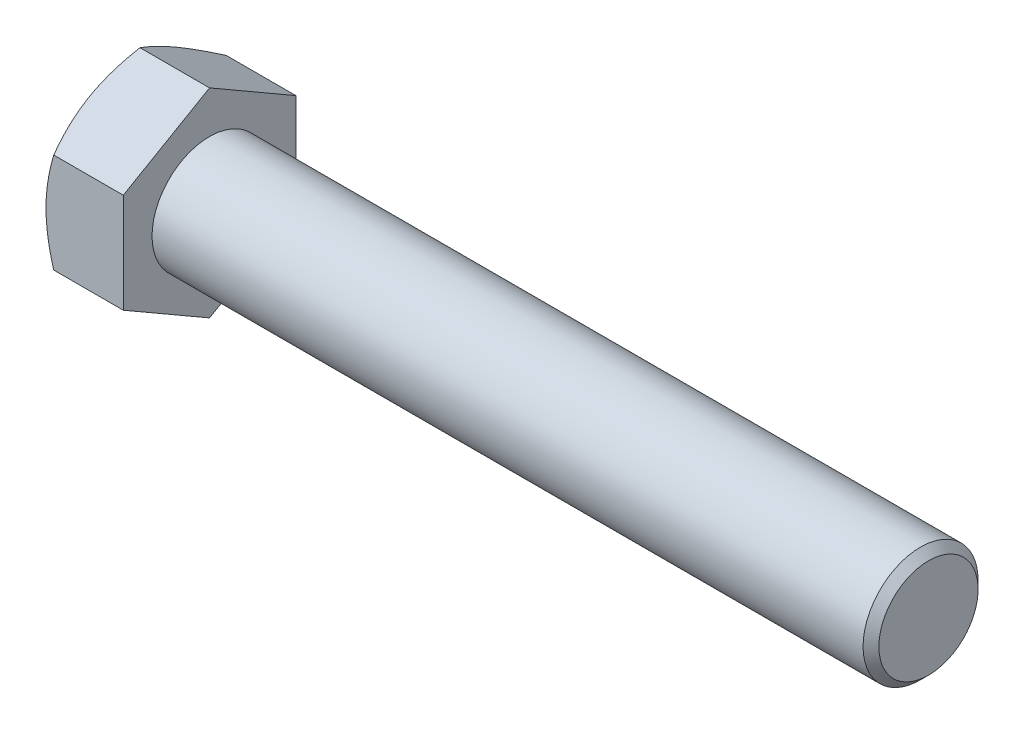
ISO-10303-21;
HEADER;
FILE_DESCRIPTION(('STEP AP214'),'2;1');
FILE_NAME('part.step','',(''),(''),'','','');
FILE_SCHEMA(('AUTOMOTIVE_DESIGN { 1 0 10303 214 1 1 1 1 }'));
ENDSEC;
DATA;
#1=APPLICATION_CONTEXT('core data for automotive mechanical design processes');
#2=APPLICATION_PROTOCOL_DEFINITION('international standard','automotive_design',2000,#1);
#3=PRODUCT_CONTEXT('',#1,'mechanical');
#4=PRODUCT('Part','Part','',(#3));
#5=PRODUCT_RELATED_PRODUCT_CATEGORY('part','',(#4));
#6=PRODUCT_DEFINITION_FORMATION('','',#4);
#7=PRODUCT_DEFINITION_CONTEXT('part definition',#1,'design');
#8=PRODUCT_DEFINITION('design','',#6,#7);
#9=PRODUCT_DEFINITION_SHAPE('','',#8);
#10=(LENGTH_UNIT() NAMED_UNIT(*) SI_UNIT(.MILLI.,.METRE.));
#11=(NAMED_UNIT(*) PLANE_ANGLE_UNIT() SI_UNIT($,.RADIAN.));
#12=(NAMED_UNIT(*) SI_UNIT($,.STERADIAN.) SOLID_ANGLE_UNIT());
#13=UNCERTAINTY_MEASURE_WITH_UNIT(LENGTH_MEASURE(1.E-05),#10,'distance_accuracy_value','');
#14=(GEOMETRIC_REPRESENTATION_CONTEXT(3) GLOBAL_UNCERTAINTY_ASSIGNED_CONTEXT((#13)) GLOBAL_UNIT_ASSIGNED_CONTEXT((#10,
#11,#12)) REPRESENTATION_CONTEXT('',''));
#15=CARTESIAN_POINT('',(0.,0.,0.));
#16=DIRECTION('',(0.,0.,1.));
#17=DIRECTION('',(1.,0.,0.));
#18=AXIS2_PLACEMENT_3D('',#15,#16,#17);
#19=CARTESIAN_POINT('',(0.,13.856406460551,0.));
#20=DIRECTION('',(1.,0.,0.));
#21=DIRECTION('',(0.,0.,-1.));
#22=AXIS2_PLACEMENT_3D('',#19,#20,#21);
#23=PLANE('',#22);
#24=CARTESIAN_POINT('',(0.,0.,0.));
#25=DIRECTION('',(1.,0.,0.));
#26=DIRECTION('',(0.,1.,0.));
#27=AXIS2_PLACEMENT_3D('',#24,#25,#26);
#28=CIRCLE('',#27,12.);
#29=CARTESIAN_POINT('',(0.,-10.3923048454133,-6.00000000000001));
#30=VERTEX_POINT('',#29);
#31=CARTESIAN_POINT('',(0.,0.,-12.));
#32=VERTEX_POINT('',#31);
#33=EDGE_CURVE('E328',#30,#32,#28,.T.);
#34=ORIENTED_EDGE('',*,*,#33,.F.);
#35=CARTESIAN_POINT('',(0.,0.,0.));
#36=DIRECTION('',(1.,0.,0.));
#37=DIRECTION('',(0.,1.,0.));
#38=AXIS2_PLACEMENT_3D('',#35,#36,#37);
#39=CIRCLE('',#38,12.);
#40=CARTESIAN_POINT('',(0.,-10.3923048454133,6.00000000000002));
#41=VERTEX_POINT('',#40);
#42=EDGE_CURVE('E327',#41,#30,#39,.T.);
#43=ORIENTED_EDGE('',*,*,#42,.F.);
#44=CARTESIAN_POINT('',(0.,0.,0.));
#45=DIRECTION('',(1.,0.,0.));
#46=DIRECTION('',(0.,1.,0.));
#47=AXIS2_PLACEMENT_3D('',#44,#45,#46);
#48=CIRCLE('',#47,12.);
#49=CARTESIAN_POINT('',(0.,0.,12.));
#50=VERTEX_POINT('',#49);
#51=EDGE_CURVE('E89',#50,#41,#48,.T.);
#52=ORIENTED_EDGE('',*,*,#51,.F.);
#53=CARTESIAN_POINT('',(0.,0.,0.));
#54=DIRECTION('',(1.,0.,0.));
#55=DIRECTION('',(0.,0.,-1.));
#56=AXIS2_PLACEMENT_3D('',#53,#54,#55);
#57=CIRCLE('',#56,12.);
#58=CARTESIAN_POINT('',(0.,10.3923048454133,6.00000000000001));
#59=VERTEX_POINT('',#58);
#60=EDGE_CURVE('E87',#59,#50,#57,.T.);
#61=ORIENTED_EDGE('',*,*,#60,.F.);
#62=CARTESIAN_POINT('',(0.,0.,0.));
#63=DIRECTION('',(1.,0.,0.));
#64=DIRECTION('',(0.,0.,-1.));
#65=AXIS2_PLACEMENT_3D('',#62,#63,#64);
#66=CIRCLE('',#65,12.);
#67=CARTESIAN_POINT('',(0.,10.3923048454133,-6.00000000000002));
#68=VERTEX_POINT('',#67);
#69=EDGE_CURVE('E20',#68,#59,#66,.T.);
#70=ORIENTED_EDGE('',*,*,#69,.F.);
#71=CARTESIAN_POINT('',(0.,0.,0.));
#72=DIRECTION('',(1.,0.,0.));
#73=DIRECTION('',(0.,0.,-1.));
#74=AXIS2_PLACEMENT_3D('',#71,#72,#73);
#75=CIRCLE('',#74,12.);
#76=EDGE_CURVE('E255',#32,#68,#75,.T.);
#77=ORIENTED_EDGE('',*,*,#76,.F.);
#78=EDGE_LOOP('',(#34,#43,#52,#61,#70,#77));
#79=FACE_BOUND('',#78,.T.);
#80=ADVANCED_FACE('F17',(#79),#23,.F.);
#81=CARTESIAN_POINT('',(1.07822755034284,0.,0.));
#82=DIRECTION('',(1.,0.,0.));
#83=DIRECTION('',(0.,0.,-1.));
#84=AXIS2_PLACEMENT_3D('',#81,#82,#83);
#85=CONICAL_SURFACE('',#84,13.8675448993143,1.0471975511966);
#86=CARTESIAN_POINT('',(1.07179676972449,13.856406460551,0.));
#87=CARTESIAN_POINT('',(0.908940799911309,13.5743006175821,-0.488621653134201));
#88=CARTESIAN_POINT('',(0.75975526693387,13.2901242461885,-0.980829566698536));
#89=CARTESIAN_POINT('',(0.562274952239646,12.8616146811394,-1.72302990489287));
#90=CARTESIAN_POINT('',(0.500950068318412,12.7187583400199,-1.9704643458952));
#91=CARTESIAN_POINT('',(0.387776318757366,12.4321091330912,-2.46695533624495));
#92=CARTESIAN_POINT('',(0.33592687570903,12.2883163249013,-2.71601178579294));
#93=CARTESIAN_POINT('',(0.242530246242278,11.9997152642606,-3.21588348594086));
#94=CARTESIAN_POINT('',(0.200995561015241,11.8549059962408,-3.46670049555793));
#95=CARTESIAN_POINT('',(0.129101019121797,11.5645948484026,-3.96953415361745));
#96=CARTESIAN_POINT('',(0.0987408683331406,11.4190929869158,-4.22155077030845));
#97=CARTESIAN_POINT('',(0.0497242910385124,11.1268576505267,-4.72771722070131));
#98=CARTESIAN_POINT('',(0.0311273829961278,10.9801216596432,-4.98187141221056));
#99=CARTESIAN_POINT('',(0.0062393443172623,10.6863610957437,-5.49067963414449));
#100=CARTESIAN_POINT('',(-4.93491989079313E-05,10.539336471344,-5.74533375356847));
#101=CARTESIAN_POINT('',(0.,10.3923048454133,-6.00000000000001));
#102=B_SPLINE_CURVE_WITH_KNOTS('',3,(#86,#87,#88,#89,#90,#91,#92,#93,#94,#95,#96,#97,#98,#99,
#100,#101),.UNSPECIFIED.,.F.,.F.,(4,2,2,2,2,2,2,4),(0.,1.76168798013763,2.63822760396066,
3.5147137959332,4.39225713601218,5.2697773768308,6.15170281893046,7.03380287133137),.UNSPECIFIED.);
#103=CARTESIAN_POINT('',(1.07179676972449,13.856406460551,0.));
#104=VERTEX_POINT('',#103);
#105=EDGE_CURVE('E99',#104,#68,#102,.T.);
#106=ORIENTED_EDGE('',*,*,#105,.T.);
#107=ORIENTED_EDGE('',*,*,#69,.T.);
#108=CARTESIAN_POINT('',(0.,10.3923048454133,6.00000000000001));
#109=CARTESIAN_POINT('',(-4.93491989066502E-05,10.539336471344,5.74533375356847));
#110=CARTESIAN_POINT('',(0.00623934431726331,10.6863610957437,5.49067963414449));
#111=CARTESIAN_POINT('',(0.0311273829961284,10.9801216596432,4.98187141221056));
#112=CARTESIAN_POINT('',(0.0497242910385127,11.1268576505267,4.72771722070131));
#113=CARTESIAN_POINT('',(0.0987408683331407,11.4190929869158,4.22155077030845));
#114=CARTESIAN_POINT('',(0.129101019121797,11.5645948484026,3.96953415361745));
#115=CARTESIAN_POINT('',(0.200995561015241,11.8549059962408,3.46670049555793));
#116=CARTESIAN_POINT('',(0.242530246242278,11.9997152642606,3.21588348594086));
#117=CARTESIAN_POINT('',(0.33592687570903,12.2883163249013,2.71601178579294));
#118=CARTESIAN_POINT('',(0.387776318757366,12.4321091330912,2.46695533624495));
#119=CARTESIAN_POINT('',(0.500950068318412,12.7187583400199,1.97046434589519));
#120=CARTESIAN_POINT('',(0.562274952239646,12.8616146811394,1.72302990489287));
#121=CARTESIAN_POINT('',(0.75975526693387,13.2901242461885,0.980829566698535));
#122=CARTESIAN_POINT('',(0.90894079991131,13.5743006175821,0.4886216531342));
#123=CARTESIAN_POINT('',(1.07179676972449,13.856406460551,0.));
#124=B_SPLINE_CURVE_WITH_KNOTS('',3,(#108,#109,#110,#111,#112,#113,#114,#115,#116,#117,#118,
#119,#120,#121,#122,#123),.UNSPECIFIED.,.F.,.F.,(4,2,2,2,2,2,2,4),(0.,0.882100052400904,
1.76402549450056,2.64154573531919,3.51908907539817,4.39557526737071,5.27211489119374,
7.03380287133137),.UNSPECIFIED.);
#125=EDGE_CURVE('E97',#59,#104,#124,.T.);
#126=ORIENTED_EDGE('',*,*,#125,.T.);
#127=EDGE_LOOP('',(#106,#107,#126));
#128=FACE_BOUND('',#127,.T.);
#129=ADVANCED_FACE('F95',(#128),#85,.T.);
#130=CARTESIAN_POINT('',(1.07822755034283,0.,0.));
#131=DIRECTION('',(1.,0.,0.));
#132=DIRECTION('',(0.,0.,-1.));
#133=AXIS2_PLACEMENT_3D('',#130,#131,#132);
#134=CONICAL_SURFACE('',#133,13.8675448993143,1.0471975511966);
#135=CARTESIAN_POINT('',(1.07179676972448,6.9282032302755,12.));
#136=CARTESIAN_POINT('',(0.908940799911304,7.21030907324441,11.5113783468658));
#137=CARTESIAN_POINT('',(0.759755266933865,7.49448544463804,11.0191704333015));
#138=CARTESIAN_POINT('',(0.562274952239641,7.92299500968717,10.2769700951071));
#139=CARTESIAN_POINT('',(0.500950068318407,8.06585135080665,10.0295356541048));
#140=CARTESIAN_POINT('',(0.387776318757363,8.3525005577353,9.53304466375506));
#141=CARTESIAN_POINT('',(0.335926875709027,8.49629336592525,9.28398821420708));
#142=CARTESIAN_POINT('',(0.242530246242276,8.78489442656593,8.78411651405915));
#143=CARTESIAN_POINT('',(0.200995561015239,8.92970369458568,8.53329950444208));
#144=CARTESIAN_POINT('',(0.129101019121795,9.22001484242395,8.03046584638256));
#145=CARTESIAN_POINT('',(0.0987408683331404,9.36551670391075,7.77844922969157));
#146=CARTESIAN_POINT('',(0.0497242910385134,9.65775204029983,7.27228277929871));
#147=CARTESIAN_POINT('',(0.0311273829961288,9.80448803118336,7.01812858778946));
#148=CARTESIAN_POINT('',(0.00623934431726292,10.0982485950828,6.50932036585553));
#149=CARTESIAN_POINT('',(-4.93491989074931E-05,10.2452732194825,6.25466624643155));
#150=CARTESIAN_POINT('',(0.,10.3923048454133,6.00000000000001));
#151=B_SPLINE_CURVE_WITH_KNOTS('',3,(#135,#136,#137,#138,#139,#140,#141,#142,#143,#144,#145,
#146,#147,#148,#149,#150),.UNSPECIFIED.,.F.,.F.,(4,2,2,2,2,2,2,4),(0.,1.76168798013762,
2.63822760396065,3.51471379593319,4.39225713601216,5.26977737683078,6.15170281893044,
7.03380287133134),.UNSPECIFIED.);
#152=CARTESIAN_POINT('',(1.07179676972448,6.9282032302755,12.));
#153=VERTEX_POINT('',#152);
#154=EDGE_CURVE('E102',#153,#59,#151,.T.);
#155=ORIENTED_EDGE('',*,*,#154,.T.);
#156=ORIENTED_EDGE('',*,*,#60,.T.);
#157=CARTESIAN_POINT('',(0.,0.,12.));
#158=CARTESIAN_POINT('',(-4.93491989070325E-05,0.29406325186152,12.));
#159=CARTESIAN_POINT('',(0.006239344317263,0.588112500660887,12.));
#160=CARTESIAN_POINT('',(0.0311273829961276,1.17563362845979,12.));
#161=CARTESIAN_POINT('',(0.0497242910385114,1.46910561022685,12.));
#162=CARTESIAN_POINT('',(0.0987408683331387,2.05357628300501,12.));
#163=CARTESIAN_POINT('',(0.129101019121794,2.34458000597862,12.));
#164=CARTESIAN_POINT('',(0.200995561015239,2.92520230165515,12.));
#165=CARTESIAN_POINT('',(0.242530246242275,3.21482083769466,12.));
#166=CARTESIAN_POINT('',(0.335926875709026,3.79202295897601,12.));
#167=CARTESIAN_POINT('',(0.387776318757362,4.0796085753559,12.));
#168=CARTESIAN_POINT('',(0.500950068318406,4.65290698921321,12.));
#169=CARTESIAN_POINT('',(0.56227495223964,4.93861967145216,12.));
#170=CARTESIAN_POINT('',(0.759755266933864,5.79563880155042,12.));
#171=CARTESIAN_POINT('',(0.908940799911303,6.36399154433768,12.));
#172=CARTESIAN_POINT('',(1.07179676972448,6.9282032302755,12.));
#173=B_SPLINE_CURVE_WITH_KNOTS('',3,(#157,#158,#159,#160,#161,#162,#163,#164,#165,#166,#167,
#168,#169,#170,#171,#172),.UNSPECIFIED.,.F.,.F.,(4,2,2,2,2,2,2,4),(0.,0.8821000524009,
1.76402549450056,2.64154573531918,3.51908907539815,4.39557526737069,5.27211489119372,
7.03380287133134),.UNSPECIFIED.);
#174=EDGE_CURVE('E105',#50,#153,#173,.T.);
#175=ORIENTED_EDGE('',*,*,#174,.T.);
#176=EDGE_LOOP('',(#155,#156,#175));
#177=FACE_BOUND('',#176,.T.);
#178=ADVANCED_FACE('F103',(#177),#134,.T.);
#179=CARTESIAN_POINT('',(1.07822755034283,0.,0.));
#180=DIRECTION('',(1.,0.,0.));
#181=DIRECTION('',(0.,1.,0.));
#182=AXIS2_PLACEMENT_3D('',#179,#180,#181);
#183=CONICAL_SURFACE('',#182,13.8675448993143,1.0471975511966);
#184=ORIENTED_EDGE('',*,*,#51,.T.);
#185=CARTESIAN_POINT('',(0.,-10.3923048454133,6.00000000000002));
#186=CARTESIAN_POINT('',(-4.93491988957589E-05,-10.2452732194825,6.25466624643156));
#187=CARTESIAN_POINT('',(0.00623934431727408,-10.0982485950828,6.50932036585554));
#188=CARTESIAN_POINT('',(0.0311273829961388,-9.80448803118338,7.01812858778947));
#189=CARTESIAN_POINT('',(0.049724291038523,-9.65775204029985,7.27228277929872));
#190=CARTESIAN_POINT('',(0.0987408683331498,-9.36551670391077,7.77844922969158));
#191=CARTESIAN_POINT('',(0.129101019121805,-9.22001484242396,8.03046584638257));
#192=CARTESIAN_POINT('',(0.200995561015249,-8.9297036945857,8.53329950444209));
#193=CARTESIAN_POINT('',(0.242530246242286,-8.78489442656594,8.78411651405916));
#194=CARTESIAN_POINT('',(0.335926875709037,-8.49629336592527,9.28398821420708));
#195=CARTESIAN_POINT('',(0.387776318757372,-8.35250055773532,9.53304466375507));
#196=CARTESIAN_POINT('',(0.500950068318416,-8.06585135080667,10.0295356541048));
#197=CARTESIAN_POINT('',(0.562274952239649,-7.92299500968719,10.2769700951071));
#198=CARTESIAN_POINT('',(0.759755266933871,-7.49448544463806,11.0191704333015));
#199=CARTESIAN_POINT('',(0.908940799911309,-7.21030907324443,11.5113783468658));
#200=CARTESIAN_POINT('',(1.07179676972449,-6.92820323027552,12.));
#201=B_SPLINE_CURVE_WITH_KNOTS('',3,(#185,#186,#187,#188,#189,#190,#191,#192,#193,#194,#195,
#196,#197,#198,#199,#200),.UNSPECIFIED.,.F.,.F.,(4,2,2,2,2,2,2,4),(0.,0.882100052400899,
1.76402549450055,2.64154573531917,3.51908907539815,4.39557526737068,5.27211489119371,
7.03380287133132),.UNSPECIFIED.);
#202=CARTESIAN_POINT('',(1.07179676972449,-6.92820323027552,12.));
#203=VERTEX_POINT('',#202);
#204=EDGE_CURVE('E174',#41,#203,#201,.T.);
#205=ORIENTED_EDGE('',*,*,#204,.T.);
#206=CARTESIAN_POINT('',(1.07179676972449,-6.92820323027552,12.));
#207=CARTESIAN_POINT('',(0.908940799911307,-6.3639915443377,12.));
#208=CARTESIAN_POINT('',(0.759755266933867,-5.79563880155044,12.));
#209=CARTESIAN_POINT('',(0.562274952239643,-4.93861967145217,12.));
#210=CARTESIAN_POINT('',(0.500950068318409,-4.65290698921322,12.));
#211=CARTESIAN_POINT('',(0.387776318757365,-4.07960857535591,12.));
#212=CARTESIAN_POINT('',(0.335926875709029,-3.79202295897602,12.));
#213=CARTESIAN_POINT('',(0.242530246242277,-3.21482083769466,12.));
#214=CARTESIAN_POINT('',(0.20099556101524,-2.92520230165516,12.));
#215=CARTESIAN_POINT('',(0.129101019121795,-2.34458000597862,12.));
#216=CARTESIAN_POINT('',(0.0987408683331391,-2.05357628300501,12.));
#217=CARTESIAN_POINT('',(0.0497242910385115,-1.46910561022686,12.));
#218=CARTESIAN_POINT('',(0.0311273829961277,-1.17563362845979,12.));
#219=CARTESIAN_POINT('',(0.00623934431726313,-0.588112500660886,12.));
#220=CARTESIAN_POINT('',(-4.93491989068253E-05,-0.294063251861518,12.));
#221=CARTESIAN_POINT('',(0.,0.,12.));
#222=B_SPLINE_CURVE_WITH_KNOTS('',3,(#206,#207,#208,#209,#210,#211,#212,#213,#214,#215,#216,
#217,#218,#219,#220,#221),.UNSPECIFIED.,.F.,.F.,(4,2,2,2,2,2,2,4),(0.,1.76168798013763,
2.63822760396066,3.5147137959332,4.39225713601218,5.2697773768308,6.15170281893046,
7.03380287133136),.UNSPECIFIED.);
#223=EDGE_CURVE('E148',#203,#50,#222,.T.);
#224=ORIENTED_EDGE('',*,*,#223,.T.);
#225=EDGE_LOOP('',(#184,#205,#224));
#226=FACE_BOUND('',#225,.T.);
#227=ADVANCED_FACE('F139',(#226),#183,.T.);
#228=CARTESIAN_POINT('',(1.07822755034285,0.,0.));
#229=DIRECTION('',(1.,0.,0.));
#230=DIRECTION('',(0.,1.,0.));
#231=AXIS2_PLACEMENT_3D('',#228,#229,#230);
#232=CONICAL_SURFACE('',#231,13.8675448993144,1.0471975511966);
#233=ORIENTED_EDGE('',*,*,#42,.T.);
#234=CARTESIAN_POINT('',(0.,-10.3923048454133,-6.00000000000002));
#235=CARTESIAN_POINT('',(-4.93491988939032E-05,-10.539336471344,-5.74533375356848));
#236=CARTESIAN_POINT('',(0.00623934431727627,-10.6863610957437,-5.4906796341445));
#237=CARTESIAN_POINT('',(0.0311273829961418,-10.9801216596432,-4.98187141221056));
#238=CARTESIAN_POINT('',(0.0497242910385263,-11.1268576505267,-4.72771722070132));
#239=CARTESIAN_POINT('',(0.0987408683331545,-11.4190929869158,-4.22155077030845));
#240=CARTESIAN_POINT('',(0.12910101912181,-11.5645948484026,-3.96953415361746));
#241=CARTESIAN_POINT('',(0.200995561015255,-11.8549059962409,-3.46670049555794));
#242=CARTESIAN_POINT('',(0.242530246242292,-11.9997152642606,-3.21588348594086));
#243=CARTESIAN_POINT('',(0.335926875709044,-12.2883163249013,-2.71601178579294));
#244=CARTESIAN_POINT('',(0.387776318757379,-12.4321091330912,-2.46695533624495));
#245=CARTESIAN_POINT('',(0.500950068318424,-12.7187583400199,-1.97046434589519));
#246=CARTESIAN_POINT('',(0.562274952239659,-12.8616146811394,-1.72302990489287));
#247=CARTESIAN_POINT('',(0.759755266933886,-13.2901242461885,-0.980829566698535));
#248=CARTESIAN_POINT('',(0.908940799911327,-13.5743006175821,-0.4886216531342));
#249=CARTESIAN_POINT('',(1.0717967697245,-13.8564064605511,0.));
#250=B_SPLINE_CURVE_WITH_KNOTS('',3,(#234,#235,#236,#237,#238,#239,#240,#241,#242,#243,#244,
#245,#246,#247,#248,#249),.UNSPECIFIED.,.F.,.F.,(4,2,2,2,2,2,2,4),(0.,0.882100052400905,
1.76402549450057,2.64154573531919,3.51908907539817,4.39557526737072,5.27211489119375,
7.03380287133138),.UNSPECIFIED.);
#251=CARTESIAN_POINT('',(1.0717967697245,-13.8564064605511,0.));
#252=VERTEX_POINT('',#251);
#253=EDGE_CURVE('E302',#30,#252,#250,.T.);
#254=ORIENTED_EDGE('',*,*,#253,.T.);
#255=CARTESIAN_POINT('',(1.0717967697245,-13.8564064605511,0.));
#256=CARTESIAN_POINT('',(0.908940799911325,-13.5743006175821,0.488621653134202));
#257=CARTESIAN_POINT('',(0.759755266933884,-13.2901242461885,0.980829566698538));
#258=CARTESIAN_POINT('',(0.562274952239658,-12.8616146811394,1.72302990489288));
#259=CARTESIAN_POINT('',(0.500950068318423,-12.7187583400199,1.9704643458952));
#260=CARTESIAN_POINT('',(0.387776318757378,-12.4321091330912,2.46695533624495));
#261=CARTESIAN_POINT('',(0.335926875709042,-12.2883163249013,2.71601178579294));
#262=CARTESIAN_POINT('',(0.24253024624229,-11.9997152642606,3.21588348594087));
#263=CARTESIAN_POINT('',(0.200995561015252,-11.8549059962409,3.46670049555794));
#264=CARTESIAN_POINT('',(0.129101019121806,-11.5645948484026,3.96953415361746));
#265=CARTESIAN_POINT('',(0.0987408683331509,-11.4190929869158,4.22155077030846));
#266=CARTESIAN_POINT('',(0.0497242910385234,-11.1268576505267,4.72771722070132));
#267=CARTESIAN_POINT('',(0.0311273829961393,-10.9801216596432,4.98187141221057));
#268=CARTESIAN_POINT('',(0.00623934431727433,-10.6863610957437,5.4906796341445));
#269=CARTESIAN_POINT('',(-4.93491988956933E-05,-10.539336471344,5.74533375356849));
#270=CARTESIAN_POINT('',(0.,-10.3923048454133,6.00000000000002));
#271=B_SPLINE_CURVE_WITH_KNOTS('',3,(#255,#256,#257,#258,#259,#260,#261,#262,#263,#264,#265,
#266,#267,#268,#269,#270),.UNSPECIFIED.,.F.,.F.,(4,2,2,2,2,2,2,4),(0.,1.76168798013763,
2.63822760396067,3.51471379593321,4.39225713601219,5.26977737683082,6.15170281893048,
7.03380287133139),.UNSPECIFIED.);
#272=EDGE_CURVE('E169',#252,#41,#271,.T.);
#273=ORIENTED_EDGE('',*,*,#272,.T.);
#274=EDGE_LOOP('',(#233,#254,#273));
#275=FACE_BOUND('',#274,.T.);
#276=ADVANCED_FACE('F318',(#275),#232,.T.);
#277=CARTESIAN_POINT('',(1.07822755034284,0.,0.));
#278=DIRECTION('',(1.,0.,0.));
#279=DIRECTION('',(0.,1.,0.));
#280=AXIS2_PLACEMENT_3D('',#277,#278,#279);
#281=CONICAL_SURFACE('',#280,13.8675448993143,1.0471975511966);
#282=ORIENTED_EDGE('',*,*,#33,.T.);
#283=CARTESIAN_POINT('',(0.,0.,-12.));
#284=CARTESIAN_POINT('',(-4.93491989071222E-05,-0.29406325186152,-12.));
#285=CARTESIAN_POINT('',(0.00623934431726316,-0.588112500660889,-12.));
#286=CARTESIAN_POINT('',(0.0311273829961286,-1.17563362845979,-12.));
#287=CARTESIAN_POINT('',(0.0497242910385131,-1.46910561022686,-12.));
#288=CARTESIAN_POINT('',(0.0987408683331405,-2.05357628300502,-12.));
#289=CARTESIAN_POINT('',(0.129101019121796,-2.34458000597863,-12.));
#290=CARTESIAN_POINT('',(0.200995561015241,-2.92520230165516,-12.));
#291=CARTESIAN_POINT('',(0.242530246242279,-3.21482083769467,-12.));
#292=CARTESIAN_POINT('',(0.33592687570903,-3.79202295897603,-12.));
#293=CARTESIAN_POINT('',(0.387776318757366,-4.07960857535592,-12.));
#294=CARTESIAN_POINT('',(0.500950068318411,-4.65290698921323,-12.));
#295=CARTESIAN_POINT('',(0.562274952239646,-4.93861967145218,-12.));
#296=CARTESIAN_POINT('',(0.759755266933871,-5.79563880155044,-12.));
#297=CARTESIAN_POINT('',(0.908940799911312,-6.36399154433771,-12.));
#298=CARTESIAN_POINT('',(1.07179676972449,-6.92820323027553,-12.));
#299=B_SPLINE_CURVE_WITH_KNOTS('',3,(#283,#284,#285,#286,#287,#288,#289,#290,#291,#292,#293,
#294,#295,#296,#297,#298),.UNSPECIFIED.,.F.,.F.,(4,2,2,2,2,2,2,4),(0.,0.882100052400904,
1.76402549450057,2.64154573531919,3.51908907539817,4.39557526737071,5.27211489119375,
7.03380287133138),.UNSPECIFIED.);
#300=CARTESIAN_POINT('',(1.07179676972449,-6.92820323027553,-12.));
#301=VERTEX_POINT('',#300);
#302=EDGE_CURVE('E233',#32,#301,#299,.T.);
#303=ORIENTED_EDGE('',*,*,#302,.T.);
#304=CARTESIAN_POINT('',(1.07179676972449,-6.92820323027553,-12.));
#305=CARTESIAN_POINT('',(0.908940799911315,-7.21030907324444,-11.5113783468658));
#306=CARTESIAN_POINT('',(0.759755266933875,-7.49448544463807,-11.0191704333015));
#307=CARTESIAN_POINT('',(0.562274952239652,-7.9229950096872,-10.2769700951071));
#308=CARTESIAN_POINT('',(0.500950068318418,-8.06585135080668,-10.0295356541048));
#309=CARTESIAN_POINT('',(0.387776318757375,-8.35250055773533,-9.53304466375507));
#310=CARTESIAN_POINT('',(0.33592687570904,-8.49629336592527,-9.28398821420708));
#311=CARTESIAN_POINT('',(0.242530246242289,-8.78489442656595,-8.78411651405916));
#312=CARTESIAN_POINT('',(0.200995561015252,-8.92970369458571,-8.53329950444209));
#313=CARTESIAN_POINT('',(0.129101019121807,-9.22001484242397,-8.03046584638257));
#314=CARTESIAN_POINT('',(0.0987408683331526,-9.36551670391078,-7.77844922969158));
#315=CARTESIAN_POINT('',(0.0497242910385258,-9.65775204029985,-7.27228277929871));
#316=CARTESIAN_POINT('',(0.0311273829961416,-9.80448803118339,-7.01812858778947));
#317=CARTESIAN_POINT('',(0.00623934431727659,-10.0982485950828,-6.50932036585554));
#318=CARTESIAN_POINT('',(-4.93491988934847E-05,-10.2452732194825,-6.25466624643156));
#319=CARTESIAN_POINT('',(0.,-10.3923048454133,-6.00000000000002));
#320=B_SPLINE_CURVE_WITH_KNOTS('',3,(#304,#305,#306,#307,#308,#309,#310,#311,#312,#313,#314,
#315,#316,#317,#318,#319),.UNSPECIFIED.,.F.,.F.,(4,2,2,2,2,2,2,4),(0.,1.76168798013761,
2.63822760396064,3.51471379593318,4.39225713601216,5.26977737683078,6.15170281893043,
7.03380287133133),.UNSPECIFIED.);
#321=EDGE_CURVE('E301',#301,#30,#320,.T.);
#322=ORIENTED_EDGE('',*,*,#321,.T.);
#323=EDGE_LOOP('',(#282,#303,#322));
#324=FACE_BOUND('',#323,.T.);
#325=ADVANCED_FACE('F247',(#324),#281,.T.);
#326=CARTESIAN_POINT('',(1.07822755034283,0.,0.));
#327=DIRECTION('',(1.,0.,0.));
#328=DIRECTION('',(0.,0.,-1.));
#329=AXIS2_PLACEMENT_3D('',#326,#327,#328);
#330=CONICAL_SURFACE('',#329,13.8675448993143,1.0471975511966);
#331=CARTESIAN_POINT('',(1.07179676972448,6.9282032302755,-12.));
#332=CARTESIAN_POINT('',(0.908940799911301,6.36399154433768,-12.));
#333=CARTESIAN_POINT('',(0.759755266933862,5.79563880155042,-12.));
#334=CARTESIAN_POINT('',(0.56227495223964,4.93861967145216,-12.));
#335=CARTESIAN_POINT('',(0.500950068318406,4.65290698921321,-12.));
#336=CARTESIAN_POINT('',(0.387776318757362,4.0796085753559,-12.));
#337=CARTESIAN_POINT('',(0.335926875709026,3.79202295897601,-12.));
#338=CARTESIAN_POINT('',(0.242530246242276,3.21482083769465,-12.));
#339=CARTESIAN_POINT('',(0.200995561015239,2.92520230165515,-12.));
#340=CARTESIAN_POINT('',(0.129101019121795,2.34458000597862,-12.));
#341=CARTESIAN_POINT('',(0.0987408683331391,2.05357628300501,-12.));
#342=CARTESIAN_POINT('',(0.0497242910385119,1.46910561022685,-12.));
#343=CARTESIAN_POINT('',(0.0311273829961279,1.17563362845979,-12.));
#344=CARTESIAN_POINT('',(0.00623934431726321,0.588112500660887,-12.));
#345=CARTESIAN_POINT('',(-4.93491989067667E-05,0.29406325186152,-12.));
#346=CARTESIAN_POINT('',(0.,0.,-12.));
#347=B_SPLINE_CURVE_WITH_KNOTS('',3,(#331,#332,#333,#334,#335,#336,#337,#338,#339,#340,#341,
#342,#343,#344,#345,#346),.UNSPECIFIED.,.F.,.F.,(4,2,2,2,2,2,2,4),(0.,1.76168798013762,
2.63822760396065,3.51471379593319,4.39225713601216,5.26977737683078,6.15170281893044,
7.03380287133134),.UNSPECIFIED.);
#348=CARTESIAN_POINT('',(1.07179676972448,6.9282032302755,-12.));
#349=VERTEX_POINT('',#348);
#350=EDGE_CURVE('E225',#349,#32,#347,.T.);
#351=ORIENTED_EDGE('',*,*,#350,.T.);
#352=ORIENTED_EDGE('',*,*,#76,.T.);
#353=CARTESIAN_POINT('',(0.,10.3923048454133,-6.00000000000001));
#354=CARTESIAN_POINT('',(-4.93491989066036E-05,10.2452732194825,-6.25466624643155));
#355=CARTESIAN_POINT('',(0.00623934431726334,10.0982485950828,-6.50932036585553));
#356=CARTESIAN_POINT('',(0.0311273829961278,9.80448803118336,-7.01812858778946));
#357=CARTESIAN_POINT('',(0.0497242910385116,9.65775204029983,-7.27228277929871));
#358=CARTESIAN_POINT('',(0.0987408683331384,9.36551670391075,-7.77844922969157));
#359=CARTESIAN_POINT('',(0.129101019121794,9.22001484242394,-8.03046584638257));
#360=CARTESIAN_POINT('',(0.200995561015238,8.92970369458568,-8.53329950444208));
#361=CARTESIAN_POINT('',(0.242530246242275,8.78489442656593,-8.78411651405915));
#362=CARTESIAN_POINT('',(0.335926875709026,8.49629336592524,-9.28398821420708));
#363=CARTESIAN_POINT('',(0.387776318757362,8.3525005577353,-9.53304466375506));
#364=CARTESIAN_POINT('',(0.500950068318406,8.06585135080665,-10.0295356541048));
#365=CARTESIAN_POINT('',(0.562274952239639,7.92299500968717,-10.2769700951071));
#366=CARTESIAN_POINT('',(0.759755266933863,7.49448544463804,-11.0191704333015));
#367=CARTESIAN_POINT('',(0.908940799911302,7.21030907324441,-11.5113783468658));
#368=CARTESIAN_POINT('',(1.07179676972448,6.9282032302755,-12.));
#369=B_SPLINE_CURVE_WITH_KNOTS('',3,(#353,#354,#355,#356,#357,#358,#359,#360,#361,#362,#363,
#364,#365,#366,#367,#368),.UNSPECIFIED.,.F.,.F.,(4,2,2,2,2,2,2,4),(0.,0.8821000524009,
1.76402549450056,2.64154573531918,3.51908907539815,4.39557526737069,5.27211489119372,
7.03380287133134),.UNSPECIFIED.);
#370=EDGE_CURVE('E115',#68,#349,#369,.T.);
#371=ORIENTED_EDGE('',*,*,#370,.T.);
#372=EDGE_LOOP('',(#351,#352,#371));
#373=FACE_BOUND('',#372,.T.);
#374=ADVANCED_FACE('F242',(#373),#330,.T.);
#375=CARTESIAN_POINT('',(110.75,0.,0.));
#376=DIRECTION('',(-1.,0.,0.));
#377=DIRECTION('',(0.,0.,1.));
#378=AXIS2_PLACEMENT_3D('',#375,#376,#377);
#379=PLANE('',#378);
#380=CARTESIAN_POINT('',(110.749999999996,0.,0.));
#381=DIRECTION('',(-1.,0.,0.));
#382=DIRECTION('',(0.,0.,1.));
#383=AXIS2_PLACEMENT_3D('',#380,#381,#382);
#384=CIRCLE('',#383,6.89850000003389);
#385=CARTESIAN_POINT('',(110.749999999996,0.,6.89850000003389));
#386=VERTEX_POINT('',#385);
#387=EDGE_CURVE('E196',#386,#386,#384,.T.);
#388=ORIENTED_EDGE('',*,*,#387,.F.);
#389=EDGE_LOOP('',(#388));
#390=FACE_BOUND('',#389,.T.);
#391=ADVANCED_FACE('F246',(#390),#379,.F.);
#392=CARTESIAN_POINT('',(10.75,6.9282032302755,-12.));
#393=DIRECTION('',(0.,-0.866025403784438,0.500000000000001));
#394=DIRECTION('',(0.,-0.500000000000001,-0.866025403784438));
#395=AXIS2_PLACEMENT_3D('',#392,#393,#394);
#396=PLANE('',#395);
#397=DIRECTION('',(1.,0.,0.));
#398=VECTOR('',#397,1.);
#399=CARTESIAN_POINT('',(10.75,13.856406460551,0.));
#400=LINE('',#399,#398);
#401=CARTESIAN_POINT('',(10.75,13.856406460551,0.));
#402=VERTEX_POINT('',#401);
#403=EDGE_CURVE('E108',#104,#402,#400,.T.);
#404=ORIENTED_EDGE('',*,*,#403,.T.);
#405=DIRECTION('',(0.,0.500000000000001,0.866025403784438));
#406=VECTOR('',#405,1.);
#407=CARTESIAN_POINT('',(10.75,6.9282032302755,-12.));
#408=LINE('',#407,#406);
#409=CARTESIAN_POINT('',(10.75,6.9282032302755,-12.));
#410=VERTEX_POINT('',#409);
#411=EDGE_CURVE('E192',#410,#402,#408,.T.);
#412=ORIENTED_EDGE('',*,*,#411,.F.);
#413=DIRECTION('',(1.,0.,0.));
#414=VECTOR('',#413,1.);
#415=CARTESIAN_POINT('',(10.75,6.9282032302755,-12.));
#416=LINE('',#415,#414);
#417=EDGE_CURVE('E232',#410,#349,#416,.F.);
#418=ORIENTED_EDGE('',*,*,#417,.T.);
#419=ORIENTED_EDGE('',*,*,#370,.F.);
#420=ORIENTED_EDGE('',*,*,#105,.F.);
#421=EDGE_LOOP('',(#404,#412,#418,#419,#420));
#422=FACE_BOUND('',#421,.T.);
#423=ADVANCED_FACE('F257',(#422),#396,.F.);
#424=CARTESIAN_POINT('',(10.75,13.856406460551,0.));
#425=DIRECTION('',(0.,-0.866025403784438,-0.500000000000001));
#426=DIRECTION('',(0.,0.500000000000001,-0.866025403784438));
#427=AXIS2_PLACEMENT_3D('',#424,#425,#426);
#428=PLANE('',#427);
#429=DIRECTION('',(-1.,0.,0.));
#430=VECTOR('',#429,1.);
#431=CARTESIAN_POINT('',(10.75,6.9282032302755,12.));
#432=LINE('',#431,#430);
#433=CARTESIAN_POINT('',(10.75,6.9282032302755,12.));
#434=VERTEX_POINT('',#433);
#435=EDGE_CURVE('E147',#153,#434,#432,.F.);
#436=ORIENTED_EDGE('',*,*,#435,.T.);
#437=DIRECTION('',(0.,-0.500000000000001,0.866025403784438));
#438=VECTOR('',#437,1.);
#439=CARTESIAN_POINT('',(10.75,13.856406460551,0.));
#440=LINE('',#439,#438);
#441=EDGE_CURVE('E195',#402,#434,#440,.T.);
#442=ORIENTED_EDGE('',*,*,#441,.F.);
#443=ORIENTED_EDGE('',*,*,#403,.F.);
#444=ORIENTED_EDGE('',*,*,#125,.F.);
#445=ORIENTED_EDGE('',*,*,#154,.F.);
#446=EDGE_LOOP('',(#436,#442,#443,#444,#445));
#447=FACE_BOUND('',#446,.T.);
#448=ADVANCED_FACE('F111',(#447),#428,.F.);
#449=CARTESIAN_POINT('',(10.75,6.9282032302755,12.));
#450=DIRECTION('',(0.,0.,-1.));
#451=DIRECTION('',(-1.,0.,0.));
#452=AXIS2_PLACEMENT_3D('',#449,#450,#451);
#453=PLANE('',#452);
#454=DIRECTION('',(1.,0.,0.));
#455=VECTOR('',#454,1.);
#456=CARTESIAN_POINT('',(10.75,-6.92820323027552,12.));
#457=LINE('',#456,#455);
#458=CARTESIAN_POINT('',(10.75,-6.92820323027552,12.));
#459=VERTEX_POINT('',#458);
#460=EDGE_CURVE('E178',#203,#459,#457,.T.);
#461=ORIENTED_EDGE('',*,*,#460,.T.);
#462=DIRECTION('',(0.,1.,0.));
#463=VECTOR('',#462,1.);
#464=CARTESIAN_POINT('',(10.75,13.856406460551,12.));
#465=LINE('',#464,#463);
#466=EDGE_CURVE('E212',#434,#459,#465,.F.);
#467=ORIENTED_EDGE('',*,*,#466,.F.);
#468=ORIENTED_EDGE('',*,*,#435,.F.);
#469=ORIENTED_EDGE('',*,*,#174,.F.);
#470=ORIENTED_EDGE('',*,*,#223,.F.);
#471=EDGE_LOOP('',(#461,#467,#468,#469,#470));
#472=FACE_BOUND('',#471,.T.);
#473=ADVANCED_FACE('F153',(#472),#453,.F.);
#474=CARTESIAN_POINT('',(10.75,-13.8564064605511,0.));
#475=DIRECTION('',(0.,0.866025403784438,-0.500000000000001));
#476=DIRECTION('',(0.,0.500000000000001,0.866025403784438));
#477=AXIS2_PLACEMENT_3D('',#474,#475,#476);
#478=PLANE('',#477);
#479=DIRECTION('',(1.,0.,0.));
#480=VECTOR('',#479,1.);
#481=CARTESIAN_POINT('',(10.75,-13.8564064605511,0.));
#482=LINE('',#481,#480);
#483=CARTESIAN_POINT('',(10.75,-13.8564064605511,0.));
#484=VERTEX_POINT('',#483);
#485=EDGE_CURVE('E299',#252,#484,#482,.T.);
#486=ORIENTED_EDGE('',*,*,#485,.T.);
#487=DIRECTION('',(0.,-0.500000000000001,-0.866025403784438));
#488=VECTOR('',#487,1.);
#489=CARTESIAN_POINT('',(10.75,-6.92820323027552,12.));
#490=LINE('',#489,#488);
#491=EDGE_CURVE('E207',#459,#484,#490,.T.);
#492=ORIENTED_EDGE('',*,*,#491,.F.);
#493=ORIENTED_EDGE('',*,*,#460,.F.);
#494=ORIENTED_EDGE('',*,*,#204,.F.);
#495=ORIENTED_EDGE('',*,*,#272,.F.);
#496=EDGE_LOOP('',(#486,#492,#493,#494,#495));
#497=FACE_BOUND('',#496,.T.);
#498=ADVANCED_FACE('F157',(#497),#478,.F.);
#499=CARTESIAN_POINT('',(10.75,-6.92820323027553,-12.));
#500=DIRECTION('',(0.,0.866025403784438,0.500000000000001));
#501=DIRECTION('',(0.,-0.500000000000001,0.866025403784438));
#502=AXIS2_PLACEMENT_3D('',#499,#500,#501);
#503=PLANE('',#502);
#504=DIRECTION('',(1.,0.,0.));
#505=VECTOR('',#504,1.);
#506=CARTESIAN_POINT('',(10.75,-6.92820323027553,-12.));
#507=LINE('',#506,#505);
#508=CARTESIAN_POINT('',(10.75,-6.92820323027553,-12.));
#509=VERTEX_POINT('',#508);
#510=EDGE_CURVE('E35',#301,#509,#507,.T.);
#511=ORIENTED_EDGE('',*,*,#510,.T.);
#512=DIRECTION('',(0.,0.500000000000001,-0.866025403784438));
#513=VECTOR('',#512,1.);
#514=CARTESIAN_POINT('',(10.75,-13.8564064605511,0.));
#515=LINE('',#514,#513);
#516=EDGE_CURVE('E202',#484,#509,#515,.T.);
#517=ORIENTED_EDGE('',*,*,#516,.F.);
#518=ORIENTED_EDGE('',*,*,#485,.F.);
#519=ORIENTED_EDGE('',*,*,#253,.F.);
#520=ORIENTED_EDGE('',*,*,#321,.F.);
#521=EDGE_LOOP('',(#511,#517,#518,#519,#520));
#522=FACE_BOUND('',#521,.T.);
#523=ADVANCED_FACE('F163',(#522),#503,.F.);
#524=CARTESIAN_POINT('',(10.75,6.9282032302755,-12.));
#525=DIRECTION('',(0.,0.,1.));
#526=DIRECTION('',(0.,-1.,0.));
#527=AXIS2_PLACEMENT_3D('',#524,#525,#526);
#528=PLANE('',#527);
#529=ORIENTED_EDGE('',*,*,#417,.F.);
#530=DIRECTION('',(0.,1.,0.));
#531=VECTOR('',#530,1.);
#532=CARTESIAN_POINT('',(10.75,13.856406460551,-12.));
#533=LINE('',#532,#531);
#534=EDGE_CURVE('E199',#509,#410,#533,.T.);
#535=ORIENTED_EDGE('',*,*,#534,.F.);
#536=ORIENTED_EDGE('',*,*,#510,.F.);
#537=ORIENTED_EDGE('',*,*,#302,.F.);
#538=ORIENTED_EDGE('',*,*,#350,.F.);
#539=EDGE_LOOP('',(#529,#535,#536,#537,#538));
#540=FACE_BOUND('',#539,.T.);
#541=ADVANCED_FACE('F239',(#540),#528,.F.);
#542=CARTESIAN_POINT('',(109.648500000048,0.,0.));
#543=DIRECTION('',(-1.,0.,0.));
#544=DIRECTION('',(0.,0.,1.));
#545=AXIS2_PLACEMENT_3D('',#542,#543,#544);
#546=CONICAL_SURFACE('',#545,7.99999999998136,0.785398163397448);
#547=CARTESIAN_POINT('',(109.6485,0.,0.));
#548=DIRECTION('',(-1.,0.,0.));
#549=DIRECTION('',(0.,0.,1.));
#550=AXIS2_PLACEMENT_3D('',#547,#548,#549);
#551=CIRCLE('',#550,8.);
#552=CARTESIAN_POINT('',(109.6485,0.,8.));
#553=VERTEX_POINT('',#552);
#554=EDGE_CURVE('E26',#553,#553,#551,.T.);
#555=ORIENTED_EDGE('',*,*,#554,.F.);
#556=EDGE_LOOP('',(#555));
#557=FACE_BOUND('',#556,.T.);
#558=ORIENTED_EDGE('',*,*,#387,.T.);
#559=EDGE_LOOP('',(#558));
#560=FACE_BOUND('',#559,.T.);
#561=ADVANCED_FACE('F276',(#557,#560),#546,.T.);
#562=CARTESIAN_POINT('',(10.75,13.856406460551,0.));
#563=DIRECTION('',(1.,0.,0.));
#564=DIRECTION('',(0.,0.,-1.));
#565=AXIS2_PLACEMENT_3D('',#562,#563,#564);
#566=PLANE('',#565);
#567=ORIENTED_EDGE('',*,*,#516,.T.);
#568=ORIENTED_EDGE('',*,*,#534,.T.);
#569=ORIENTED_EDGE('',*,*,#411,.T.);
#570=ORIENTED_EDGE('',*,*,#441,.T.);
#571=ORIENTED_EDGE('',*,*,#466,.T.);
#572=ORIENTED_EDGE('',*,*,#491,.T.);
#573=EDGE_LOOP('',(#567,#568,#569,#570,#571,#572));
#574=FACE_BOUND('',#573,.T.);
#575=CARTESIAN_POINT('',(10.75,0.,0.));
#576=DIRECTION('',(-1.,0.,0.));
#577=DIRECTION('',(0.,0.,1.));
#578=AXIS2_PLACEMENT_3D('',#575,#576,#577);
#579=CIRCLE('',#578,8.);
#580=CARTESIAN_POINT('',(10.75,0.,8.));
#581=VERTEX_POINT('',#580);
#582=EDGE_CURVE('E11',#581,#581,#579,.F.);
#583=ORIENTED_EDGE('',*,*,#582,.F.);
#584=EDGE_LOOP('',(#583));
#585=FACE_BOUND('',#584,.T.);
#586=ADVANCED_FACE('F270',(#574,#585),#566,.T.);
#587=CARTESIAN_POINT('',(0.,0.,0.));
#588=DIRECTION('',(-1.,0.,0.));
#589=DIRECTION('',(0.,0.,1.));
#590=AXIS2_PLACEMENT_3D('',#587,#588,#589);
#591=CYLINDRICAL_SURFACE('',#590,8.);
#592=ORIENTED_EDGE('',*,*,#582,.T.);
#593=EDGE_LOOP('',(#592));
#594=FACE_BOUND('',#593,.T.);
#595=ORIENTED_EDGE('',*,*,#554,.T.);
#596=EDGE_LOOP('',(#595));
#597=FACE_BOUND('',#596,.T.);
#598=ADVANCED_FACE('F268',(#594,#597),#591,.T.);
#599=CLOSED_SHELL('',(#80,#129,#178,#227,#276,#325,#374,#391,#423,#448,#473,#498,#523,#541,#561,
#586,#598));
#600=MANIFOLD_SOLID_BREP('B1',#599);
#601=ADVANCED_BREP_SHAPE_REPRESENTATION('',(#18,#600),#14);
#602=SHAPE_DEFINITION_REPRESENTATION(#9,#601);
ENDSEC;
END-ISO-10303-21;
